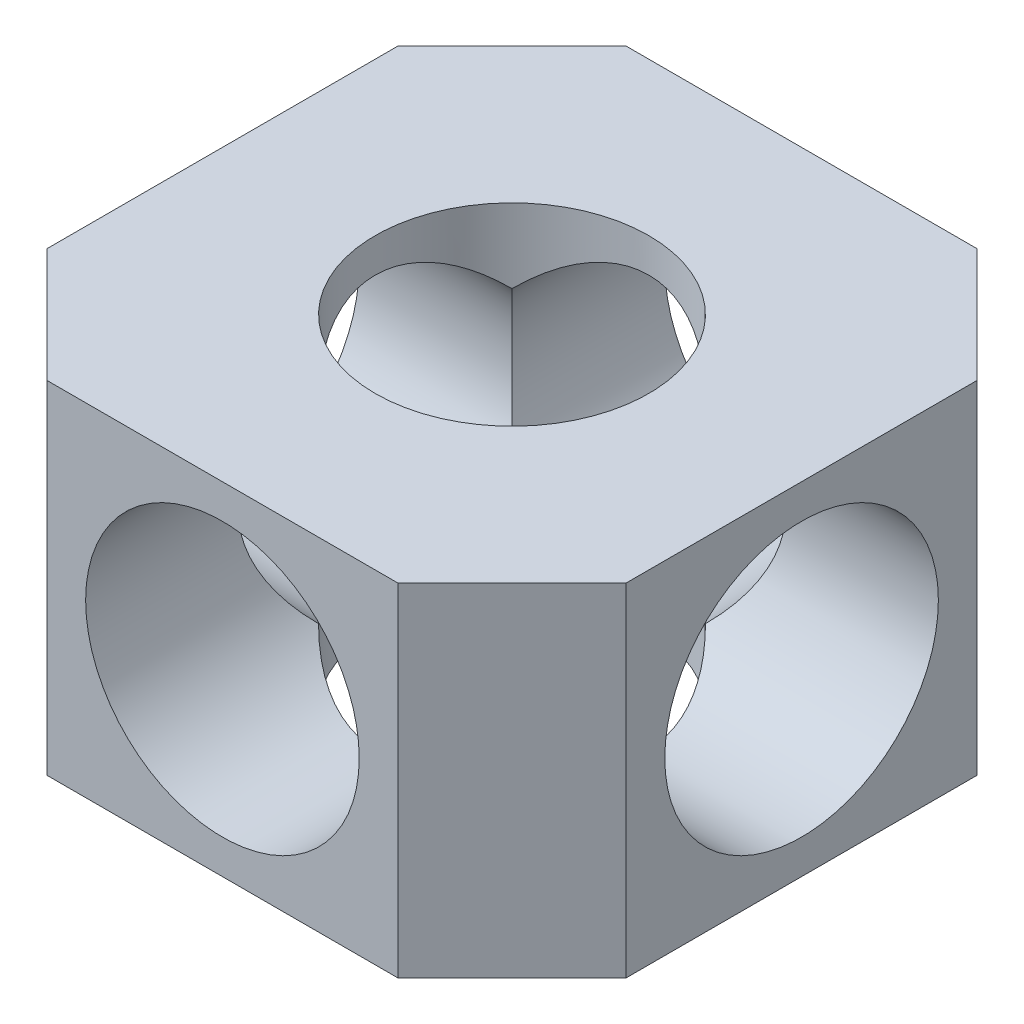
ISO-10303-21;
HEADER;
FILE_DESCRIPTION(('STEP AP214'),'2;1');
FILE_NAME('part.step','',(''),(''),'','','');
FILE_SCHEMA(('AUTOMOTIVE_DESIGN { 1 0 10303 214 1 1 1 1 }'));
ENDSEC;
DATA;
#1=APPLICATION_CONTEXT('core data for automotive mechanical design processes');
#2=APPLICATION_PROTOCOL_DEFINITION('international standard','automotive_design',2000,#1);
#3=PRODUCT_CONTEXT('',#1,'mechanical');
#4=PRODUCT('Part','Part','',(#3));
#5=PRODUCT_RELATED_PRODUCT_CATEGORY('part','',(#4));
#6=PRODUCT_DEFINITION_FORMATION('','',#4);
#7=PRODUCT_DEFINITION_CONTEXT('part definition',#1,'design');
#8=PRODUCT_DEFINITION('design','',#6,#7);
#9=PRODUCT_DEFINITION_SHAPE('','',#8);
#10=(LENGTH_UNIT() NAMED_UNIT(*) SI_UNIT(.MILLI.,.METRE.));
#11=(NAMED_UNIT(*) PLANE_ANGLE_UNIT() SI_UNIT($,.RADIAN.));
#12=(NAMED_UNIT(*) SI_UNIT($,.STERADIAN.) SOLID_ANGLE_UNIT());
#13=UNCERTAINTY_MEASURE_WITH_UNIT(LENGTH_MEASURE(1.E-05),#10,'distance_accuracy_value','');
#14=(GEOMETRIC_REPRESENTATION_CONTEXT(3) GLOBAL_UNCERTAINTY_ASSIGNED_CONTEXT((#13)) GLOBAL_UNIT_ASSIGNED_CONTEXT((#10,
#11,#12)) REPRESENTATION_CONTEXT('',''));
#15=CARTESIAN_POINT('',(0.,0.,0.));
#16=DIRECTION('',(0.,0.,1.));
#17=DIRECTION('',(1.,0.,0.));
#18=AXIS2_PLACEMENT_3D('',#15,#16,#17);
#19=CARTESIAN_POINT('',(0.,-7.5,0.));
#20=DIRECTION('',(0.,1.,0.));
#21=DIRECTION('',(0.,0.,1.));
#22=AXIS2_PLACEMENT_3D('',#19,#20,#21);
#23=CYLINDRICAL_SURFACE('',#22,6.);
#24=CARTESIAN_POINT('',(0.,-7.5,0.));
#25=DIRECTION('',(0.,1.,0.));
#26=DIRECTION('',(0.,0.,1.));
#27=AXIS2_PLACEMENT_3D('',#24,#25,#26);
#28=CIRCLE('',#27,6.);
#29=CARTESIAN_POINT('',(0.,-7.5,6.));
#30=VERTEX_POINT('',#29);
#31=EDGE_CURVE('E175',#30,#30,#28,.T.);
#32=ORIENTED_EDGE('',*,*,#31,.F.);
#33=EDGE_LOOP('',(#32));
#34=FACE_BOUND('',#33,.T.);
#35=CARTESIAN_POINT('',(0.,0.,0.));
#36=DIRECTION('',(0.,0.707106781186548,0.707106781186547));
#37=DIRECTION('',(0.,-0.707106781186548,0.707106781186547));
#38=AXIS2_PLACEMENT_3D('',#35,#36,#37);
#39=ELLIPSE('',#38,8.48528137423857,6.);
#40=CARTESIAN_POINT('',(4.2426406871193,-4.24264068711928,4.24264068711928));
#41=VERTEX_POINT('',#40);
#42=CARTESIAN_POINT('',(-4.24264068711927,-4.24264068711931,4.24264068711931));
#43=VERTEX_POINT('',#42);
#44=EDGE_CURVE('E153',#41,#43,#39,.F.);
#45=ORIENTED_EDGE('',*,*,#44,.F.);
#46=CARTESIAN_POINT('',(0.,0.,0.));
#47=DIRECTION('',(0.707106781186547,0.707106781186547,0.));
#48=DIRECTION('',(0.707106781186547,-0.707106781186547,0.));
#49=AXIS2_PLACEMENT_3D('',#46,#47,#48);
#50=ELLIPSE('',#49,8.48528137423857,6.);
#51=CARTESIAN_POINT('',(4.24264068711928,-4.24264068711929,-4.24264068711929));
#52=VERTEX_POINT('',#51);
#53=EDGE_CURVE('E425',#52,#41,#50,.F.);
#54=ORIENTED_EDGE('',*,*,#53,.F.);
#55=CARTESIAN_POINT('',(0.,0.,0.));
#56=DIRECTION('',(0.,0.707106781186547,-0.707106781186547));
#57=DIRECTION('',(0.,-0.707106781186547,-0.707106781186547));
#58=AXIS2_PLACEMENT_3D('',#55,#56,#57);
#59=ELLIPSE('',#58,8.48528137423857,6.);
#60=CARTESIAN_POINT('',(-4.24264068711931,-4.24264068711926,-4.24264068711926));
#61=VERTEX_POINT('',#60);
#62=EDGE_CURVE('E155',#61,#52,#59,.F.);
#63=ORIENTED_EDGE('',*,*,#62,.F.);
#64=CARTESIAN_POINT('',(0.,0.,0.));
#65=DIRECTION('',(-0.707106781186547,0.707106781186547,0.));
#66=DIRECTION('',(-0.707106781186547,-0.707106781186547,0.));
#67=AXIS2_PLACEMENT_3D('',#64,#65,#66);
#68=ELLIPSE('',#67,8.48528137423857,6.);
#69=EDGE_CURVE('E142',#43,#61,#68,.F.);
#70=ORIENTED_EDGE('',*,*,#69,.F.);
#71=EDGE_LOOP('',(#45,#54,#63,#70));
#72=FACE_BOUND('',#71,.T.);
#73=ADVANCED_FACE('F49',(#34,#72),#23,.F.);
#74=CARTESIAN_POINT('',(12.7,7.5,-12.7));
#75=DIRECTION('',(-1.,0.,0.));
#76=DIRECTION('',(0.,0.,1.));
#77=AXIS2_PLACEMENT_3D('',#74,#75,#76);
#78=PLANE('',#77);
#79=CARTESIAN_POINT('',(12.7,0.,0.));
#80=DIRECTION('',(1.,0.,0.));
#81=DIRECTION('',(0.,0.,-1.));
#82=AXIS2_PLACEMENT_3D('',#79,#80,#81);
#83=CIRCLE('',#82,6.);
#84=CARTESIAN_POINT('',(12.7,0.,-6.00000000000005));
#85=VERTEX_POINT('',#84);
#86=EDGE_CURVE('E428',#85,#85,#83,.T.);
#87=ORIENTED_EDGE('',*,*,#86,.F.);
#88=EDGE_LOOP('',(#87));
#89=FACE_BOUND('',#88,.T.);
#90=DIRECTION('',(0.,0.,-1.));
#91=VECTOR('',#90,1.);
#92=CARTESIAN_POINT('',(12.7,7.5,-12.7));
#93=LINE('',#92,#91);
#94=CARTESIAN_POINT('',(12.7,7.5,7.69999999999998));
#95=VERTEX_POINT('',#94);
#96=CARTESIAN_POINT('',(12.7,7.5,-7.69999999999998));
#97=VERTEX_POINT('',#96);
#98=EDGE_CURVE('E183',#95,#97,#93,.T.);
#99=ORIENTED_EDGE('',*,*,#98,.F.);
#100=DIRECTION('',(0.,-1.,0.));
#101=VECTOR('',#100,1.);
#102=CARTESIAN_POINT('',(12.7,7.5,7.69999999999998));
#103=LINE('',#102,#101);
#104=CARTESIAN_POINT('',(12.7,-7.5,7.69999999999998));
#105=VERTEX_POINT('',#104);
#106=EDGE_CURVE('E253',#95,#105,#103,.T.);
#107=ORIENTED_EDGE('',*,*,#106,.T.);
#108=DIRECTION('',(0.,0.,-1.));
#109=VECTOR('',#108,1.);
#110=CARTESIAN_POINT('',(12.7,-7.5,-12.7));
#111=LINE('',#110,#109);
#112=CARTESIAN_POINT('',(12.7,-7.5,-7.69999999999998));
#113=VERTEX_POINT('',#112);
#114=EDGE_CURVE('E179',#105,#113,#111,.T.);
#115=ORIENTED_EDGE('',*,*,#114,.T.);
#116=DIRECTION('',(0.,1.,0.));
#117=VECTOR('',#116,1.);
#118=CARTESIAN_POINT('',(12.7,7.5,-7.69999999999998));
#119=LINE('',#118,#117);
#120=EDGE_CURVE('E250',#113,#97,#119,.T.);
#121=ORIENTED_EDGE('',*,*,#120,.T.);
#122=EDGE_LOOP('',(#99,#107,#115,#121));
#123=FACE_BOUND('',#122,.T.);
#124=ADVANCED_FACE('F292',(#89,#123),#78,.F.);
#125=CARTESIAN_POINT('',(-12.7,7.5,-12.7));
#126=DIRECTION('',(0.,0.,1.));
#127=DIRECTION('',(1.,0.,0.));
#128=AXIS2_PLACEMENT_3D('',#125,#126,#127);
#129=PLANE('',#128);
#130=CARTESIAN_POINT('',(0.,0.,-12.7));
#131=DIRECTION('',(0.,0.,-1.));
#132=DIRECTION('',(-1.,0.,0.));
#133=AXIS2_PLACEMENT_3D('',#130,#131,#132);
#134=CIRCLE('',#133,6.);
#135=CARTESIAN_POINT('',(-6.,0.,-12.7));
#136=VERTEX_POINT('',#135);
#137=EDGE_CURVE('E409',#136,#136,#134,.T.);
#138=ORIENTED_EDGE('',*,*,#137,.F.);
#139=EDGE_LOOP('',(#138));
#140=FACE_BOUND('',#139,.T.);
#141=DIRECTION('',(-1.,0.,0.));
#142=VECTOR('',#141,1.);
#143=CARTESIAN_POINT('',(-12.7,-7.5,-12.7));
#144=LINE('',#143,#142);
#145=CARTESIAN_POINT('',(7.69999999999999,-7.5,-12.7));
#146=VERTEX_POINT('',#145);
#147=CARTESIAN_POINT('',(-7.69999999999999,-7.5,-12.7));
#148=VERTEX_POINT('',#147);
#149=EDGE_CURVE('E203',#146,#148,#144,.T.);
#150=ORIENTED_EDGE('',*,*,#149,.T.);
#151=DIRECTION('',(0.,1.,0.));
#152=VECTOR('',#151,1.);
#153=CARTESIAN_POINT('',(-7.69999999999999,7.5,-12.7));
#154=LINE('',#153,#152);
#155=CARTESIAN_POINT('',(-7.69999999999999,7.5,-12.7));
#156=VERTEX_POINT('',#155);
#157=EDGE_CURVE('E11',#148,#156,#154,.T.);
#158=ORIENTED_EDGE('',*,*,#157,.T.);
#159=DIRECTION('',(-1.,0.,0.));
#160=VECTOR('',#159,1.);
#161=CARTESIAN_POINT('',(-12.7,7.5,-12.7));
#162=LINE('',#161,#160);
#163=CARTESIAN_POINT('',(7.69999999999999,7.5,-12.7));
#164=VERTEX_POINT('',#163);
#165=EDGE_CURVE('E187',#164,#156,#162,.T.);
#166=ORIENTED_EDGE('',*,*,#165,.F.);
#167=DIRECTION('',(0.,-1.,0.));
#168=VECTOR('',#167,1.);
#169=CARTESIAN_POINT('',(7.69999999999999,7.5,-12.7));
#170=LINE('',#169,#168);
#171=EDGE_CURVE('E59',#164,#146,#170,.T.);
#172=ORIENTED_EDGE('',*,*,#171,.T.);
#173=EDGE_LOOP('',(#150,#158,#166,#172));
#174=FACE_BOUND('',#173,.T.);
#175=ADVANCED_FACE('F260',(#140,#174),#129,.F.);
#176=CARTESIAN_POINT('',(-12.7,7.5,-12.7));
#177=DIRECTION('',(1.,0.,0.));
#178=DIRECTION('',(0.,0.,-1.));
#179=AXIS2_PLACEMENT_3D('',#176,#177,#178);
#180=PLANE('',#179);
#181=CARTESIAN_POINT('',(-12.7,0.,1.33025439009923E-13));
#182=DIRECTION('',(-1.,0.,0.));
#183=DIRECTION('',(0.,0.,1.));
#184=AXIS2_PLACEMENT_3D('',#181,#182,#183);
#185=CIRCLE('',#184,6.);
#186=CARTESIAN_POINT('',(-12.6999999999999,0.,6.00000000000013));
#187=VERTEX_POINT('',#186);
#188=EDGE_CURVE('E407',#187,#187,#185,.T.);
#189=ORIENTED_EDGE('',*,*,#188,.F.);
#190=EDGE_LOOP('',(#189));
#191=FACE_BOUND('',#190,.T.);
#192=DIRECTION('',(0.,0.,1.));
#193=VECTOR('',#192,1.);
#194=CARTESIAN_POINT('',(-12.7,-7.5,-12.7));
#195=LINE('',#194,#193);
#196=CARTESIAN_POINT('',(-12.7,-7.5,-7.69999999999999));
#197=VERTEX_POINT('',#196);
#198=CARTESIAN_POINT('',(-12.7,-7.5,7.69999999999999));
#199=VERTEX_POINT('',#198);
#200=EDGE_CURVE('E206',#197,#199,#195,.T.);
#201=ORIENTED_EDGE('',*,*,#200,.T.);
#202=DIRECTION('',(0.,1.,0.));
#203=VECTOR('',#202,1.);
#204=CARTESIAN_POINT('',(-12.7,7.5,7.69999999999999));
#205=LINE('',#204,#203);
#206=CARTESIAN_POINT('',(-12.7,7.5,7.69999999999999));
#207=VERTEX_POINT('',#206);
#208=EDGE_CURVE('E235',#199,#207,#205,.T.);
#209=ORIENTED_EDGE('',*,*,#208,.T.);
#210=DIRECTION('',(0.,0.,1.));
#211=VECTOR('',#210,1.);
#212=CARTESIAN_POINT('',(-12.7,7.5,-12.7));
#213=LINE('',#212,#211);
#214=CARTESIAN_POINT('',(-12.7,7.5,-7.69999999999999));
#215=VERTEX_POINT('',#214);
#216=EDGE_CURVE('E191',#215,#207,#213,.T.);
#217=ORIENTED_EDGE('',*,*,#216,.F.);
#218=DIRECTION('',(0.,-1.,0.));
#219=VECTOR('',#218,1.);
#220=CARTESIAN_POINT('',(-12.7,7.5,-7.69999999999999));
#221=LINE('',#220,#219);
#222=EDGE_CURVE('E231',#215,#197,#221,.T.);
#223=ORIENTED_EDGE('',*,*,#222,.T.);
#224=EDGE_LOOP('',(#201,#209,#217,#223));
#225=FACE_BOUND('',#224,.T.);
#226=ADVANCED_FACE('F274',(#191,#225),#180,.F.);
#227=CARTESIAN_POINT('',(-12.7,7.5,12.7));
#228=DIRECTION('',(0.,0.,-1.));
#229=DIRECTION('',(-1.,0.,0.));
#230=AXIS2_PLACEMENT_3D('',#227,#228,#229);
#231=PLANE('',#230);
#232=CARTESIAN_POINT('',(0.,0.,12.7));
#233=DIRECTION('',(0.,0.,1.));
#234=DIRECTION('',(1.,0.,0.));
#235=AXIS2_PLACEMENT_3D('',#232,#233,#234);
#236=CIRCLE('',#235,6.);
#237=CARTESIAN_POINT('',(6.,0.,12.7));
#238=VERTEX_POINT('',#237);
#239=EDGE_CURVE('E162',#238,#238,#236,.T.);
#240=ORIENTED_EDGE('',*,*,#239,.F.);
#241=EDGE_LOOP('',(#240));
#242=FACE_BOUND('',#241,.T.);
#243=DIRECTION('',(1.,0.,0.));
#244=VECTOR('',#243,1.);
#245=CARTESIAN_POINT('',(-12.7,7.5,12.7));
#246=LINE('',#245,#244);
#247=CARTESIAN_POINT('',(-7.69999999999998,7.5,12.7));
#248=VERTEX_POINT('',#247);
#249=CARTESIAN_POINT('',(7.69999999999998,7.5,12.7));
#250=VERTEX_POINT('',#249);
#251=EDGE_CURVE('E195',#248,#250,#246,.T.);
#252=ORIENTED_EDGE('',*,*,#251,.F.);
#253=DIRECTION('',(0.,-1.,0.));
#254=VECTOR('',#253,1.);
#255=CARTESIAN_POINT('',(-7.69999999999998,7.5,12.7));
#256=LINE('',#255,#254);
#257=CARTESIAN_POINT('',(-7.69999999999998,-7.5,12.7));
#258=VERTEX_POINT('',#257);
#259=EDGE_CURVE('E215',#248,#258,#256,.T.);
#260=ORIENTED_EDGE('',*,*,#259,.T.);
#261=DIRECTION('',(1.,0.,0.));
#262=VECTOR('',#261,1.);
#263=CARTESIAN_POINT('',(-12.7,-7.5,12.7));
#264=LINE('',#263,#262);
#265=CARTESIAN_POINT('',(7.69999999999998,-7.5,12.7));
#266=VERTEX_POINT('',#265);
#267=EDGE_CURVE('E188',#258,#266,#264,.T.);
#268=ORIENTED_EDGE('',*,*,#267,.T.);
#269=DIRECTION('',(0.,1.,0.));
#270=VECTOR('',#269,1.);
#271=CARTESIAN_POINT('',(7.69999999999998,7.5,12.7));
#272=LINE('',#271,#270);
#273=EDGE_CURVE('E199',#266,#250,#272,.T.);
#274=ORIENTED_EDGE('',*,*,#273,.T.);
#275=EDGE_LOOP('',(#252,#260,#268,#274));
#276=FACE_BOUND('',#275,.T.);
#277=ADVANCED_FACE('F284',(#242,#276),#231,.F.);
#278=CARTESIAN_POINT('',(0.,7.5,0.));
#279=DIRECTION('',(0.,1.,0.));
#280=DIRECTION('',(0.,0.,1.));
#281=AXIS2_PLACEMENT_3D('',#278,#279,#280);
#282=PLANE('',#281);
#283=CARTESIAN_POINT('',(0.,7.5,0.));
#284=DIRECTION('',(0.,1.,0.));
#285=DIRECTION('',(0.,0.,1.));
#286=AXIS2_PLACEMENT_3D('',#283,#284,#285);
#287=CIRCLE('',#286,6.);
#288=CARTESIAN_POINT('',(0.,7.5,6.));
#289=VERTEX_POINT('',#288);
#290=EDGE_CURVE('E168',#289,#289,#287,.T.);
#291=ORIENTED_EDGE('',*,*,#290,.F.);
#292=EDGE_LOOP('',(#291));
#293=FACE_BOUND('',#292,.T.);
#294=ORIENTED_EDGE('',*,*,#216,.T.);
#295=DIRECTION('',(-0.707106781186547,0.,-0.707106781186548));
#296=VECTOR('',#295,1.);
#297=CARTESIAN_POINT('',(-10.2,7.5,10.2));
#298=LINE('',#297,#296);
#299=EDGE_CURVE('E247',#207,#248,#298,.F.);
#300=ORIENTED_EDGE('',*,*,#299,.T.);
#301=ORIENTED_EDGE('',*,*,#251,.T.);
#302=DIRECTION('',(-0.707106781186548,0.,0.707106781186548));
#303=VECTOR('',#302,1.);
#304=CARTESIAN_POINT('',(10.2,7.5,10.2));
#305=LINE('',#304,#303);
#306=EDGE_CURVE('E244',#250,#95,#305,.F.);
#307=ORIENTED_EDGE('',*,*,#306,.T.);
#308=ORIENTED_EDGE('',*,*,#98,.T.);
#309=DIRECTION('',(0.707106781186548,0.,0.707106781186548));
#310=VECTOR('',#309,1.);
#311=CARTESIAN_POINT('',(10.2,7.5,-10.2));
#312=LINE('',#311,#310);
#313=EDGE_CURVE('E238',#97,#164,#312,.F.);
#314=ORIENTED_EDGE('',*,*,#313,.T.);
#315=ORIENTED_EDGE('',*,*,#165,.T.);
#316=DIRECTION('',(0.707106781186548,0.,-0.707106781186547));
#317=VECTOR('',#316,1.);
#318=CARTESIAN_POINT('',(-10.2,7.5,-10.2));
#319=LINE('',#318,#317);
#320=EDGE_CURVE('E241',#156,#215,#319,.F.);
#321=ORIENTED_EDGE('',*,*,#320,.T.);
#322=EDGE_LOOP('',(#294,#300,#301,#307,#308,#314,#315,#321));
#323=FACE_BOUND('',#322,.T.);
#324=ADVANCED_FACE('F278',(#293,#323),#282,.T.);
#325=CARTESIAN_POINT('',(0.,-7.5,0.));
#326=DIRECTION('',(0.,1.,0.));
#327=DIRECTION('',(0.,0.,1.));
#328=AXIS2_PLACEMENT_3D('',#325,#326,#327);
#329=PLANE('',#328);
#330=ORIENTED_EDGE('',*,*,#31,.T.);
#331=EDGE_LOOP('',(#330));
#332=FACE_BOUND('',#331,.T.);
#333=ORIENTED_EDGE('',*,*,#267,.F.);
#334=DIRECTION('',(0.707106781186547,0.,0.707106781186548));
#335=VECTOR('',#334,1.);
#336=CARTESIAN_POINT('',(-7.69999999999998,-7.5,12.7));
#337=LINE('',#336,#335);
#338=EDGE_CURVE('E228',#258,#199,#337,.F.);
#339=ORIENTED_EDGE('',*,*,#338,.T.);
#340=ORIENTED_EDGE('',*,*,#200,.F.);
#341=DIRECTION('',(-0.707106781186548,0.,0.707106781186547));
#342=VECTOR('',#341,1.);
#343=CARTESIAN_POINT('',(-12.7,-7.5,-7.69999999999999));
#344=LINE('',#343,#342);
#345=EDGE_CURVE('E222',#197,#148,#344,.F.);
#346=ORIENTED_EDGE('',*,*,#345,.T.);
#347=ORIENTED_EDGE('',*,*,#149,.F.);
#348=DIRECTION('',(-0.707106781186548,0.,-0.707106781186548));
#349=VECTOR('',#348,1.);
#350=CARTESIAN_POINT('',(7.69999999999999,-7.5,-12.7));
#351=LINE('',#350,#349);
#352=EDGE_CURVE('E219',#146,#113,#351,.F.);
#353=ORIENTED_EDGE('',*,*,#352,.T.);
#354=ORIENTED_EDGE('',*,*,#114,.F.);
#355=DIRECTION('',(0.707106781186548,0.,-0.707106781186548));
#356=VECTOR('',#355,1.);
#357=CARTESIAN_POINT('',(12.7,-7.5,7.69999999999998));
#358=LINE('',#357,#356);
#359=EDGE_CURVE('E225',#105,#266,#358,.F.);
#360=ORIENTED_EDGE('',*,*,#359,.T.);
#361=EDGE_LOOP('',(#333,#339,#340,#346,#347,#353,#354,#360));
#362=FACE_BOUND('',#361,.T.);
#363=ADVANCED_FACE('F265',(#332,#362),#329,.F.);
#364=CARTESIAN_POINT('',(-7.69999999999998,7.5,12.7));
#365=DIRECTION('',(0.707106781186548,0.,-0.707106781186548));
#366=DIRECTION('',(0.,-1.,0.));
#367=AXIS2_PLACEMENT_3D('',#364,#365,#366);
#368=PLANE('',#367);
#369=ORIENTED_EDGE('',*,*,#299,.F.);
#370=ORIENTED_EDGE('',*,*,#208,.F.);
#371=ORIENTED_EDGE('',*,*,#338,.F.);
#372=ORIENTED_EDGE('',*,*,#259,.F.);
#373=EDGE_LOOP('',(#369,#370,#371,#372));
#374=FACE_BOUND('',#373,.T.);
#375=ADVANCED_FACE('F282',(#374),#368,.F.);
#376=CARTESIAN_POINT('',(12.7,7.5,7.69999999999998));
#377=DIRECTION('',(-0.707106781186547,0.,-0.707106781186547));
#378=DIRECTION('',(0.,-1.,0.));
#379=AXIS2_PLACEMENT_3D('',#376,#377,#378);
#380=PLANE('',#379);
#381=ORIENTED_EDGE('',*,*,#306,.F.);
#382=ORIENTED_EDGE('',*,*,#273,.F.);
#383=ORIENTED_EDGE('',*,*,#359,.F.);
#384=ORIENTED_EDGE('',*,*,#106,.F.);
#385=EDGE_LOOP('',(#381,#382,#383,#384));
#386=FACE_BOUND('',#385,.T.);
#387=ADVANCED_FACE('F289',(#386),#380,.F.);
#388=CARTESIAN_POINT('',(-12.7,7.5,-7.69999999999999));
#389=DIRECTION('',(0.707106781186547,0.,0.707106781186548));
#390=DIRECTION('',(0.,-1.,0.));
#391=AXIS2_PLACEMENT_3D('',#388,#389,#390);
#392=PLANE('',#391);
#393=ORIENTED_EDGE('',*,*,#320,.F.);
#394=ORIENTED_EDGE('',*,*,#157,.F.);
#395=ORIENTED_EDGE('',*,*,#345,.F.);
#396=ORIENTED_EDGE('',*,*,#222,.F.);
#397=EDGE_LOOP('',(#393,#394,#395,#396));
#398=FACE_BOUND('',#397,.T.);
#399=ADVANCED_FACE('F271',(#398),#392,.F.);
#400=CARTESIAN_POINT('',(7.69999999999999,7.5,-12.7));
#401=DIRECTION('',(-0.707106781186548,0.,0.707106781186548));
#402=DIRECTION('',(0.,-1.,0.));
#403=AXIS2_PLACEMENT_3D('',#400,#401,#402);
#404=PLANE('',#403);
#405=ORIENTED_EDGE('',*,*,#313,.F.);
#406=ORIENTED_EDGE('',*,*,#120,.F.);
#407=ORIENTED_EDGE('',*,*,#352,.F.);
#408=ORIENTED_EDGE('',*,*,#171,.F.);
#409=EDGE_LOOP('',(#405,#406,#407,#408));
#410=FACE_BOUND('',#409,.T.);
#411=ADVANCED_FACE('F52',(#410),#404,.F.);
#412=CARTESIAN_POINT('',(0.,0.,0.));
#413=DIRECTION('',(0.,-0.707106781186547,-0.707106781186547));
#414=DIRECTION('',(0.,0.707106781186547,-0.707106781186547));
#415=AXIS2_PLACEMENT_3D('',#412,#413,#414);
#416=ELLIPSE('',#415,8.48528137423857,6.);
#417=CARTESIAN_POINT('',(4.24264068711928,4.24264068711929,-4.24264068711929));
#418=VERTEX_POINT('',#417);
#419=CARTESIAN_POINT('',(-4.24264068711931,4.24264068711926,-4.24264068711926));
#420=VERTEX_POINT('',#419);
#421=EDGE_CURVE('E414',#418,#420,#416,.F.);
#422=ORIENTED_EDGE('',*,*,#421,.F.);
#423=CARTESIAN_POINT('',(0.,0.,0.));
#424=DIRECTION('',(0.707106781186547,-0.707106781186547,0.));
#425=DIRECTION('',(0.707106781186547,0.707106781186547,0.));
#426=AXIS2_PLACEMENT_3D('',#423,#424,#425);
#427=ELLIPSE('',#426,8.48528137423857,6.);
#428=CARTESIAN_POINT('',(4.2426406871193,4.24264068711928,4.24264068711928));
#429=VERTEX_POINT('',#428);
#430=EDGE_CURVE('E429',#429,#418,#427,.F.);
#431=ORIENTED_EDGE('',*,*,#430,.F.);
#432=CARTESIAN_POINT('',(0.,0.,0.));
#433=DIRECTION('',(0.,-0.707106781186548,0.707106781186547));
#434=DIRECTION('',(0.,0.707106781186548,0.707106781186547));
#435=AXIS2_PLACEMENT_3D('',#432,#433,#434);
#436=ELLIPSE('',#435,8.48528137423857,6.);
#437=CARTESIAN_POINT('',(-4.24264068711926,4.24264068711931,4.24264068711931));
#438=VERTEX_POINT('',#437);
#439=EDGE_CURVE('E163',#438,#429,#436,.F.);
#440=ORIENTED_EDGE('',*,*,#439,.F.);
#441=CARTESIAN_POINT('',(0.,0.,0.));
#442=DIRECTION('',(-0.707106781186547,-0.707106781186547,0.));
#443=DIRECTION('',(-0.707106781186547,0.707106781186547,0.));
#444=AXIS2_PLACEMENT_3D('',#441,#442,#443);
#445=ELLIPSE('',#444,8.48528137423857,6.);
#446=EDGE_CURVE('E66',#420,#438,#445,.F.);
#447=ORIENTED_EDGE('',*,*,#446,.F.);
#448=EDGE_LOOP('',(#422,#431,#440,#447));
#449=FACE_BOUND('',#448,.T.);
#450=ORIENTED_EDGE('',*,*,#290,.T.);
#451=EDGE_LOOP('',(#450));
#452=FACE_BOUND('',#451,.T.);
#453=ADVANCED_FACE('F295',(#449,#452),#23,.F.);
#454=CARTESIAN_POINT('',(0.,0.,-12.701));
#455=DIRECTION('',(0.,0.,1.));
#456=DIRECTION('',(1.,0.,0.));
#457=AXIS2_PLACEMENT_3D('',#454,#455,#456);
#458=CYLINDRICAL_SURFACE('',#457,6.);
#459=ORIENTED_EDGE('',*,*,#239,.T.);
#460=EDGE_LOOP('',(#459));
#461=FACE_BOUND('',#460,.T.);
#462=ORIENTED_EDGE('',*,*,#439,.T.);
#463=CARTESIAN_POINT('',(0.,0.,0.));
#464=DIRECTION('',(0.707106781186546,0.,-0.707106781186549));
#465=DIRECTION('',(0.707106781186549,0.,0.707106781186546));
#466=AXIS2_PLACEMENT_3D('',#463,#464,#465);
#467=ELLIPSE('',#466,8.48528137423856,6.);
#468=EDGE_CURVE('E160',#41,#429,#467,.F.);
#469=ORIENTED_EDGE('',*,*,#468,.F.);
#470=ORIENTED_EDGE('',*,*,#44,.T.);
#471=CARTESIAN_POINT('',(0.,0.,0.));
#472=DIRECTION('',(-0.707106781186551,0.,-0.707106781186544));
#473=DIRECTION('',(-0.707106781186544,0.,0.707106781186551));
#474=AXIS2_PLACEMENT_3D('',#471,#472,#473);
#475=ELLIPSE('',#474,8.48528137423862,6.);
#476=EDGE_CURVE('E139',#438,#43,#475,.F.);
#477=ORIENTED_EDGE('',*,*,#476,.F.);
#478=EDGE_LOOP('',(#462,#469,#470,#477));
#479=FACE_BOUND('',#478,.T.);
#480=ADVANCED_FACE('F159',(#461,#479),#458,.F.);
#481=CARTESIAN_POINT('',(-12.701,0.,0.));
#482=DIRECTION('',(1.,0.,0.));
#483=DIRECTION('',(0.,0.,-1.));
#484=AXIS2_PLACEMENT_3D('',#481,#482,#483);
#485=CYLINDRICAL_SURFACE('',#484,6.);
#486=CARTESIAN_POINT('',(0.,0.,0.));
#487=DIRECTION('',(0.707106781186549,0.,0.707106781186546));
#488=DIRECTION('',(0.707106781186546,0.,-0.707106781186549));
#489=AXIS2_PLACEMENT_3D('',#486,#487,#488);
#490=ELLIPSE('',#489,8.48528137423859,6.);
#491=EDGE_CURVE('E170',#418,#52,#490,.F.);
#492=ORIENTED_EDGE('',*,*,#491,.T.);
#493=ORIENTED_EDGE('',*,*,#53,.T.);
#494=ORIENTED_EDGE('',*,*,#468,.T.);
#495=ORIENTED_EDGE('',*,*,#430,.T.);
#496=EDGE_LOOP('',(#492,#493,#494,#495));
#497=FACE_BOUND('',#496,.T.);
#498=ORIENTED_EDGE('',*,*,#86,.T.);
#499=EDGE_LOOP('',(#498));
#500=FACE_BOUND('',#499,.T.);
#501=ADVANCED_FACE('F371',(#497,#500),#485,.F.);
#502=CARTESIAN_POINT('',(0.,0.,12.701));
#503=DIRECTION('',(0.,0.,-1.));
#504=DIRECTION('',(-1.,0.,0.));
#505=AXIS2_PLACEMENT_3D('',#502,#503,#504);
#506=CYLINDRICAL_SURFACE('',#505,6.);
#507=ORIENTED_EDGE('',*,*,#421,.T.);
#508=CARTESIAN_POINT('',(0.,0.,0.));
#509=DIRECTION('',(0.707106781186544,0.,-0.707106781186551));
#510=DIRECTION('',(-0.707106781186551,0.,-0.707106781186544));
#511=AXIS2_PLACEMENT_3D('',#508,#509,#510);
#512=ELLIPSE('',#511,8.48528137423853,6.);
#513=EDGE_CURVE('E422',#420,#61,#512,.F.);
#514=ORIENTED_EDGE('',*,*,#513,.T.);
#515=ORIENTED_EDGE('',*,*,#62,.T.);
#516=ORIENTED_EDGE('',*,*,#491,.F.);
#517=EDGE_LOOP('',(#507,#514,#515,#516));
#518=FACE_BOUND('',#517,.T.);
#519=ORIENTED_EDGE('',*,*,#137,.T.);
#520=EDGE_LOOP('',(#519));
#521=FACE_BOUND('',#520,.T.);
#522=ADVANCED_FACE('F384',(#518,#521),#506,.F.);
#523=CARTESIAN_POINT('',(12.7010000000001,0.,-1.33035913453941E-13));
#524=DIRECTION('',(-1.,0.,0.));
#525=DIRECTION('',(0.,0.,1.));
#526=AXIS2_PLACEMENT_3D('',#523,#524,#525);
#527=CYLINDRICAL_SURFACE('',#526,6.);
#528=ORIENTED_EDGE('',*,*,#188,.T.);
#529=EDGE_LOOP('',(#528));
#530=FACE_BOUND('',#529,.T.);
#531=ORIENTED_EDGE('',*,*,#446,.T.);
#532=ORIENTED_EDGE('',*,*,#476,.T.);
#533=ORIENTED_EDGE('',*,*,#69,.T.);
#534=ORIENTED_EDGE('',*,*,#513,.F.);
#535=EDGE_LOOP('',(#531,#532,#533,#534));
#536=FACE_BOUND('',#535,.T.);
#537=ADVANCED_FACE('F141',(#530,#536),#527,.F.);
#538=CLOSED_SHELL('',(#73,#124,#175,#226,#277,#324,#363,#375,#387,#399,#411,#453,#480,#501,#522,#537));
#539=MANIFOLD_SOLID_BREP('B2',#538);
#540=ADVANCED_BREP_SHAPE_REPRESENTATION('',(#18,#539),#14);
#541=SHAPE_DEFINITION_REPRESENTATION(#9,#540);
ENDSEC;
END-ISO-10303-21;
